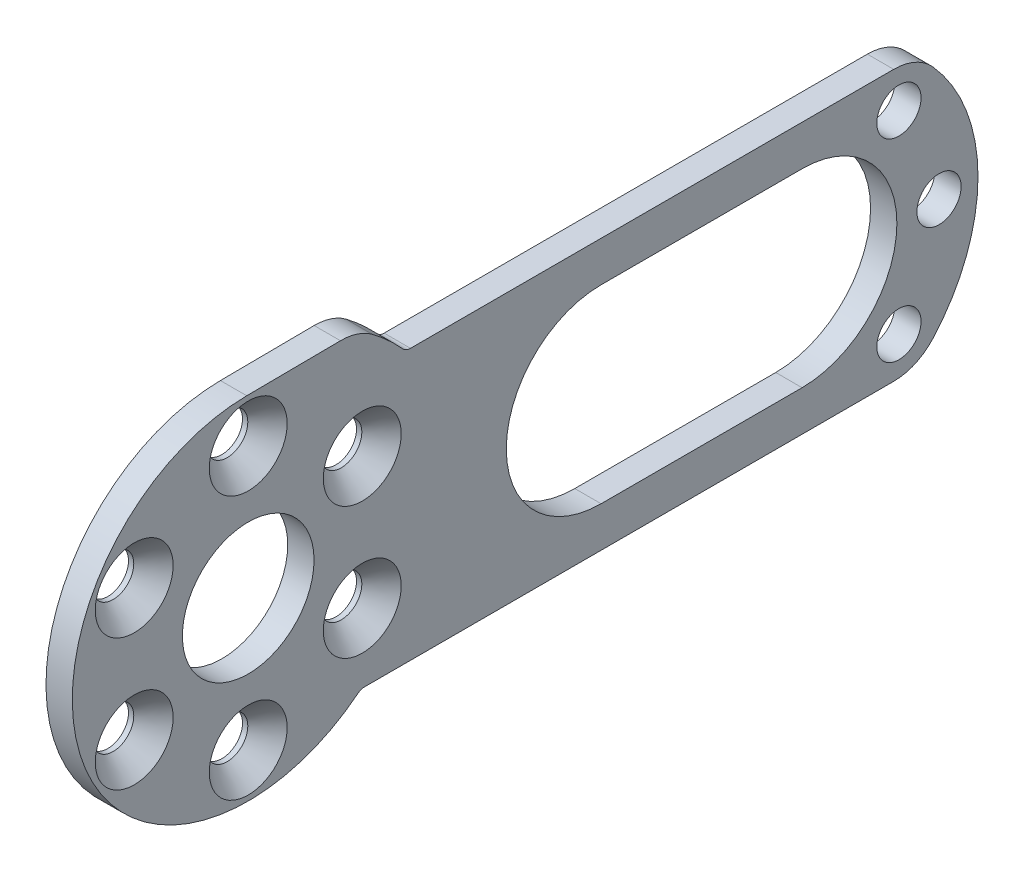
ISO-10303-21;
HEADER;
FILE_DESCRIPTION(('STEP AP214'),'2;1');
FILE_NAME('part.step','',(''),(''),'','','');
FILE_SCHEMA(('AUTOMOTIVE_DESIGN { 1 0 10303 214 1 1 1 1 }'));
ENDSEC;
DATA;
#1=APPLICATION_CONTEXT('core data for automotive mechanical design processes');
#2=APPLICATION_PROTOCOL_DEFINITION('international standard','automotive_design',2000,#1);
#3=PRODUCT_CONTEXT('',#1,'mechanical');
#4=PRODUCT('Part','Part','',(#3));
#5=PRODUCT_RELATED_PRODUCT_CATEGORY('part','',(#4));
#6=PRODUCT_DEFINITION_FORMATION('','',#4);
#7=PRODUCT_DEFINITION_CONTEXT('part definition',#1,'design');
#8=PRODUCT_DEFINITION('design','',#6,#7);
#9=PRODUCT_DEFINITION_SHAPE('','',#8);
#10=(LENGTH_UNIT() NAMED_UNIT(*) SI_UNIT(.MILLI.,.METRE.));
#11=(NAMED_UNIT(*) PLANE_ANGLE_UNIT() SI_UNIT($,.RADIAN.));
#12=(NAMED_UNIT(*) SI_UNIT($,.STERADIAN.) SOLID_ANGLE_UNIT());
#13=UNCERTAINTY_MEASURE_WITH_UNIT(LENGTH_MEASURE(1.E-05),#10,'distance_accuracy_value','');
#14=(GEOMETRIC_REPRESENTATION_CONTEXT(3) GLOBAL_UNCERTAINTY_ASSIGNED_CONTEXT((#13)) GLOBAL_UNIT_ASSIGNED_CONTEXT((#10,
#11,#12)) REPRESENTATION_CONTEXT('',''));
#15=CARTESIAN_POINT('',(0.,0.,0.));
#16=DIRECTION('',(0.,0.,1.));
#17=DIRECTION('',(1.,0.,0.));
#18=AXIS2_PLACEMENT_3D('',#15,#16,#17);
#19=CARTESIAN_POINT('',(-2.74319999999998,0.,0.));
#20=DIRECTION('',(1.,0.,0.));
#21=DIRECTION('',(0.,0.,-1.));
#22=AXIS2_PLACEMENT_3D('',#19,#20,#21);
#23=PLANE('',#22);
#24=CARTESIAN_POINT('',(-2.74319999999998,0.,0.));
#25=DIRECTION('',(1.,0.,0.));
#26=DIRECTION('',(0.,0.,-1.));
#27=AXIS2_PLACEMENT_3D('',#24,#25,#26);
#28=CIRCLE('',#27,7.9375);
#29=CARTESIAN_POINT('',(-2.74319999999998,0.,-7.9375));
#30=VERTEX_POINT('',#29);
#31=EDGE_CURVE('E240',#30,#30,#28,.T.);
#32=ORIENTED_EDGE('',*,*,#31,.T.);
#33=EDGE_LOOP('',(#32));
#34=FACE_BOUND('',#33,.T.);
#35=DIRECTION('',(0.,0.,-1.));
#36=VECTOR('',#35,1.);
#37=CARTESIAN_POINT('',(-2.74319999999998,-11.43,-42.545));
#38=LINE('',#37,#36);
#39=CARTESIAN_POINT('',(-2.74319999999998,-11.43,-42.545));
#40=VERTEX_POINT('',#39);
#41=CARTESIAN_POINT('',(-2.74319999999998,-11.43,-66.77914));
#42=VERTEX_POINT('',#41);
#43=EDGE_CURVE('E218',#40,#42,#38,.T.);
#44=ORIENTED_EDGE('',*,*,#43,.T.);
#45=CARTESIAN_POINT('',(-2.74319999999998,0.,-66.77914));
#46=DIRECTION('',(1.,0.,0.));
#47=DIRECTION('',(0.,0.,-1.));
#48=AXIS2_PLACEMENT_3D('',#45,#46,#47);
#49=CIRCLE('',#48,11.43);
#50=CARTESIAN_POINT('',(-2.74319999999998,11.43,-66.77914));
#51=VERTEX_POINT('',#50);
#52=EDGE_CURVE('E208',#42,#51,#49,.T.);
#53=ORIENTED_EDGE('',*,*,#52,.T.);
#54=DIRECTION('',(0.,0.,1.));
#55=VECTOR('',#54,1.);
#56=CARTESIAN_POINT('',(-2.74319999999998,11.43,-66.77914));
#57=LINE('',#56,#55);
#58=CARTESIAN_POINT('',(-2.74319999999998,11.43,-42.545));
#59=VERTEX_POINT('',#58);
#60=EDGE_CURVE('E211',#51,#59,#57,.T.);
#61=ORIENTED_EDGE('',*,*,#60,.T.);
#62=CARTESIAN_POINT('',(-2.74319999999998,0.,-42.545));
#63=DIRECTION('',(1.,0.,0.));
#64=DIRECTION('',(0.,0.,-1.));
#65=AXIS2_PLACEMENT_3D('',#62,#63,#64);
#66=CIRCLE('',#65,11.43);
#67=EDGE_CURVE('E215',#59,#40,#66,.T.);
#68=ORIENTED_EDGE('',*,*,#67,.T.);
#69=EDGE_LOOP('',(#44,#53,#61,#68));
#70=FACE_BOUND('',#69,.T.);
#71=CARTESIAN_POINT('',(-2.74319999999998,7.93750000000016,13.7481532850779));
#72=DIRECTION('',(1.,0.,0.));
#73=DIRECTION('',(0.,0.,-1.));
#74=AXIS2_PLACEMENT_3D('',#71,#72,#73);
#75=CIRCLE('',#74,2.4892);
#76=CARTESIAN_POINT('',(-2.74319999999998,7.93750000000016,11.2589532850779));
#77=VERTEX_POINT('',#76);
#78=EDGE_CURVE('E204',#77,#77,#75,.T.);
#79=ORIENTED_EDGE('',*,*,#78,.T.);
#80=EDGE_LOOP('',(#79));
#81=FACE_BOUND('',#80,.T.);
#82=CARTESIAN_POINT('',(-2.74319999999998,-7.93749999999987,13.748153285078));
#83=DIRECTION('',(1.,0.,0.));
#84=DIRECTION('',(0.,0.,-1.));
#85=AXIS2_PLACEMENT_3D('',#82,#83,#84);
#86=CIRCLE('',#85,2.4892);
#87=CARTESIAN_POINT('',(-2.74319999999998,-7.93749999999987,11.258953285078));
#88=VERTEX_POINT('',#87);
#89=EDGE_CURVE('E201',#88,#88,#86,.T.);
#90=ORIENTED_EDGE('',*,*,#89,.T.);
#91=EDGE_LOOP('',(#90));
#92=FACE_BOUND('',#91,.T.);
#93=CARTESIAN_POINT('',(-2.74319999999998,-15.875,0.));
#94=DIRECTION('',(1.,0.,0.));
#95=DIRECTION('',(0.,0.,-1.));
#96=AXIS2_PLACEMENT_3D('',#93,#94,#95);
#97=CIRCLE('',#96,2.4892);
#98=CARTESIAN_POINT('',(-2.74319999999998,-15.875,-2.4892));
#99=VERTEX_POINT('',#98);
#100=EDGE_CURVE('E198',#99,#99,#97,.T.);
#101=ORIENTED_EDGE('',*,*,#100,.T.);
#102=EDGE_LOOP('',(#101));
#103=FACE_BOUND('',#102,.T.);
#104=CARTESIAN_POINT('',(-2.74319999999998,-7.93750000000007,-13.7481532850779));
#105=DIRECTION('',(1.,0.,0.));
#106=DIRECTION('',(0.,0.,-1.));
#107=AXIS2_PLACEMENT_3D('',#104,#105,#106);
#108=CIRCLE('',#107,2.4892);
#109=CARTESIAN_POINT('',(-2.74319999999998,-7.93750000000007,-16.2373532850779));
#110=VERTEX_POINT('',#109);
#111=EDGE_CURVE('E195',#110,#110,#108,.T.);
#112=ORIENTED_EDGE('',*,*,#111,.T.);
#113=EDGE_LOOP('',(#112));
#114=FACE_BOUND('',#113,.T.);
#115=CARTESIAN_POINT('',(-2.74319999999998,7.93749999999997,-13.748153285078));
#116=DIRECTION('',(1.,0.,0.));
#117=DIRECTION('',(0.,0.,-1.));
#118=AXIS2_PLACEMENT_3D('',#115,#116,#117);
#119=CIRCLE('',#118,2.4892);
#120=CARTESIAN_POINT('',(-2.74319999999998,7.93749999999997,-16.237353285078));
#121=VERTEX_POINT('',#120);
#122=EDGE_CURVE('E191',#121,#121,#119,.T.);
#123=ORIENTED_EDGE('',*,*,#122,.T.);
#124=EDGE_LOOP('',(#123));
#125=FACE_BOUND('',#124,.T.);
#126=CARTESIAN_POINT('',(-2.74319999999998,15.875,0.));
#127=DIRECTION('',(1.,0.,0.));
#128=DIRECTION('',(0.,0.,-1.));
#129=AXIS2_PLACEMENT_3D('',#126,#127,#128);
#130=CIRCLE('',#129,2.4892);
#131=CARTESIAN_POINT('',(-2.74319999999998,15.875,-2.4892));
#132=VERTEX_POINT('',#131);
#133=EDGE_CURVE('E188',#132,#132,#130,.T.);
#134=ORIENTED_EDGE('',*,*,#133,.T.);
#135=EDGE_LOOP('',(#134));
#136=FACE_BOUND('',#135,.T.);
#137=CARTESIAN_POINT('',(-2.74319999999998,11.6743329573899,-78.4534729573899));
#138=DIRECTION('',(-1.,0.,0.));
#139=DIRECTION('',(0.,0.,1.));
#140=AXIS2_PLACEMENT_3D('',#137,#138,#139);
#141=CIRCLE('',#140,2.667);
#142=CARTESIAN_POINT('',(-2.74319999999998,11.6743329573899,-75.7864729573899));
#143=VERTEX_POINT('',#142);
#144=EDGE_CURVE('E159',#143,#143,#141,.T.);
#145=ORIENTED_EDGE('',*,*,#144,.F.);
#146=EDGE_LOOP('',(#145));
#147=FACE_BOUND('',#146,.T.);
#148=CARTESIAN_POINT('',(-2.74319999999998,0.,-83.28914));
#149=DIRECTION('',(-1.,0.,0.));
#150=DIRECTION('',(0.,0.,1.));
#151=AXIS2_PLACEMENT_3D('',#148,#149,#150);
#152=CIRCLE('',#151,2.667);
#153=CARTESIAN_POINT('',(-2.74319999999998,0.,-80.62214));
#154=VERTEX_POINT('',#153);
#155=EDGE_CURVE('E183',#154,#154,#152,.T.);
#156=ORIENTED_EDGE('',*,*,#155,.F.);
#157=EDGE_LOOP('',(#156));
#158=FACE_BOUND('',#157,.T.);
#159=CARTESIAN_POINT('',(-2.74319999999998,-11.6743329573899,-78.4534729573899));
#160=DIRECTION('',(-1.,0.,0.));
#161=DIRECTION('',(0.,0.,1.));
#162=AXIS2_PLACEMENT_3D('',#159,#160,#161);
#163=CIRCLE('',#162,2.66699999999998);
#164=CARTESIAN_POINT('',(-2.74319999999998,-11.6743329573899,-75.7864729573899));
#165=VERTEX_POINT('',#164);
#166=EDGE_CURVE('E179',#165,#165,#163,.T.);
#167=ORIENTED_EDGE('',*,*,#166,.F.);
#168=EDGE_LOOP('',(#167));
#169=FACE_BOUND('',#168,.T.);
#170=DIRECTION('',(0.,0.00843900847276286,-0.999964390933995));
#171=VECTOR('',#170,1.);
#172=CARTESIAN_POINT('',(-2.74319999999998,21.2082447673191,0.178982930698907));
#173=LINE('',#172,#171);
#174=CARTESIAN_POINT('',(-2.74319999999998,21.2082447673191,0.178982930698907));
#175=VERTEX_POINT('',#174);
#176=CARTESIAN_POINT('',(-2.74319999999998,21.3036248588064,-11.1229010997692));
#177=VERTEX_POINT('',#176);
#178=EDGE_CURVE('E150',#175,#177,#173,.T.);
#179=ORIENTED_EDGE('',*,*,#178,.T.);
#180=CARTESIAN_POINT('',(-2.74319999999998,14.9538509763755,-11.1764888035712));
#181=DIRECTION('',(1.,0.,0.));
#182=DIRECTION('',(0.,0.,-1.));
#183=AXIS2_PLACEMENT_3D('',#180,#181,#182);
#184=CIRCLE('',#183,6.35);
#185=CARTESIAN_POINT('',(-2.74319999999998,20.040194845891,-14.978015607507));
#186=VERTEX_POINT('',#185);
#187=EDGE_CURVE('E257',#177,#186,#184,.F.);
#188=ORIENTED_EDGE('',*,*,#187,.T.);
#189=CARTESIAN_POINT('',(-2.74319999999998,0.,0.));
#190=DIRECTION('',(-1.,0.,0.));
#191=DIRECTION('',(0.,0.,1.));
#192=AXIS2_PLACEMENT_3D('',#189,#190,#191);
#193=CIRCLE('',#192,25.019);
#194=CARTESIAN_POINT('',(-2.74319999999998,16.7129324077992,-18.617955079233));
#195=VERTEX_POINT('',#194);
#196=EDGE_CURVE('E166',#186,#195,#193,.T.);
#197=ORIENTED_EDGE('',*,*,#196,.T.);
#198=CARTESIAN_POINT('',(-2.74319999999998,17.5613046112407,-19.563028941123));
#199=DIRECTION('',(1.,0.,0.));
#200=DIRECTION('',(0.,0.,-1.));
#201=AXIS2_PLACEMENT_3D('',#198,#199,#200);
#202=CIRCLE('',#201,1.27);
#203=CARTESIAN_POINT('',(-2.74319999999998,16.2913046112407,-19.563028941123));
#204=VERTEX_POINT('',#203);
#205=EDGE_CURVE('E287',#195,#204,#202,.T.);
#206=ORIENTED_EDGE('',*,*,#205,.T.);
#207=DIRECTION('',(0.,0.,-1.));
#208=VECTOR('',#207,1.);
#209=CARTESIAN_POINT('',(-2.74319999999998,16.2913046112407,-18.9879897583648));
#210=LINE('',#209,#208);
#211=CARTESIAN_POINT('',(-2.74319999999998,16.2913046112407,-77.8227057116044));
#212=VERTEX_POINT('',#211);
#213=EDGE_CURVE('E169',#204,#212,#210,.T.);
#214=ORIENTED_EDGE('',*,*,#213,.T.);
#215=CARTESIAN_POINT('',(-2.74319999999998,9.94130461124073,-77.8227057116044));
#216=DIRECTION('',(1.,0.,0.));
#217=DIRECTION('',(0.,0.,-1.));
#218=AXIS2_PLACEMENT_3D('',#215,#216,#217);
#219=CIRCLE('',#218,6.35);
#220=CARTESIAN_POINT('',(-2.74319999999998,14.1897253852752,-82.542178237931));
#221=VERTEX_POINT('',#220);
#222=EDGE_CURVE('E255',#212,#221,#219,.F.);
#223=ORIENTED_EDGE('',*,*,#222,.T.);
#224=CARTESIAN_POINT('',(-2.74319999999998,0.,-66.77914));
#225=DIRECTION('',(-1.,0.,0.));
#226=DIRECTION('',(0.,0.,1.));
#227=AXIS2_PLACEMENT_3D('',#224,#225,#226);
#228=CIRCLE('',#227,21.209);
#229=CARTESIAN_POINT('',(-2.74319999999998,-14.1897253852752,-82.542178237931));
#230=VERTEX_POINT('',#229);
#231=EDGE_CURVE('E174',#221,#230,#228,.T.);
#232=ORIENTED_EDGE('',*,*,#231,.T.);
#233=CARTESIAN_POINT('',(-2.74319999999998,-9.94130461124075,-77.8227057116044));
#234=DIRECTION('',(1.,0.,0.));
#235=DIRECTION('',(0.,0.,-1.));
#236=AXIS2_PLACEMENT_3D('',#233,#234,#235);
#237=CIRCLE('',#236,6.35);
#238=CARTESIAN_POINT('',(-2.74319999999998,-16.2913046112407,-77.8227057116044));
#239=VERTEX_POINT('',#238);
#240=EDGE_CURVE('E253',#230,#239,#237,.F.);
#241=ORIENTED_EDGE('',*,*,#240,.T.);
#242=DIRECTION('',(0.,0.,1.));
#243=VECTOR('',#242,1.);
#244=CARTESIAN_POINT('',(-2.74319999999998,-16.2913046112407,-80.3590912172823));
#245=LINE('',#244,#243);
#246=CARTESIAN_POINT('',(-2.74319999999998,-16.2913046112407,-14.0323205975068));
#247=VERTEX_POINT('',#246);
#248=EDGE_CURVE('E177',#239,#247,#245,.T.);
#249=ORIENTED_EDGE('',*,*,#248,.T.);
#250=CARTESIAN_POINT('',(-2.74319999999998,-17.5613046112407,-14.0323205975068));
#251=DIRECTION('',(1.,0.,0.));
#252=DIRECTION('',(0.,0.,-1.));
#253=AXIS2_PLACEMENT_3D('',#250,#251,#252);
#254=CIRCLE('',#253,1.27);
#255=CARTESIAN_POINT('',(-2.74319999999998,-16.5691405089108,-13.2395341230714));
#256=VERTEX_POINT('',#255);
#257=EDGE_CURVE('E65',#247,#256,#254,.T.);
#258=ORIENTED_EDGE('',*,*,#257,.T.);
#259=CARTESIAN_POINT('',(-2.74319999999998,0.,0.));
#260=DIRECTION('',(-1.,0.,0.));
#261=DIRECTION('',(0.,0.,1.));
#262=AXIS2_PLACEMENT_3D('',#259,#260,#261);
#263=CIRCLE('',#262,21.209);
#264=EDGE_CURVE('E147',#256,#175,#263,.T.);
#265=ORIENTED_EDGE('',*,*,#264,.T.);
#266=EDGE_LOOP('',(#179,#188,#197,#206,#214,#223,#232,#241,#249,#258,#265));
#267=FACE_BOUND('',#266,.T.);
#268=ADVANCED_FACE('F41',(#34,#70,#81,#92,#103,#114,#125,#136,#147,#158,#169,#267),#23,.F.);
#269=CARTESIAN_POINT('',(0.431800000000019,0.,0.));
#270=DIRECTION('',(1.,0.,0.));
#271=DIRECTION('',(0.,0.,-1.));
#272=AXIS2_PLACEMENT_3D('',#269,#270,#271);
#273=PLANE('',#272);
#274=CARTESIAN_POINT('',(0.431800000000019,15.875,0.));
#275=DIRECTION('',(1.,0.,0.));
#276=DIRECTION('',(0.,0.,-1.));
#277=AXIS2_PLACEMENT_3D('',#274,#275,#276);
#278=CIRCLE('',#277,4.69718831405322);
#279=CARTESIAN_POINT('',(0.431800000000019,15.875,-4.69718831405322));
#280=VERTEX_POINT('',#279);
#281=EDGE_CURVE('E312',#280,#280,#278,.F.);
#282=ORIENTED_EDGE('',*,*,#281,.T.);
#283=EDGE_LOOP('',(#282));
#284=FACE_BOUND('',#283,.T.);
#285=CARTESIAN_POINT('',(0.431800000000019,7.93749999999997,-13.748153285078));
#286=DIRECTION('',(1.,0.,0.));
#287=DIRECTION('',(0.,0.,-1.));
#288=AXIS2_PLACEMENT_3D('',#285,#286,#287);
#289=CIRCLE('',#288,4.69718831405322);
#290=CARTESIAN_POINT('',(0.431800000000019,7.93749999999997,-18.4453415991312));
#291=VERTEX_POINT('',#290);
#292=EDGE_CURVE('E309',#291,#291,#289,.F.);
#293=ORIENTED_EDGE('',*,*,#292,.T.);
#294=EDGE_LOOP('',(#293));
#295=FACE_BOUND('',#294,.T.);
#296=CARTESIAN_POINT('',(0.431800000000019,-7.93750000000007,-13.7481532850779));
#297=DIRECTION('',(1.,0.,0.));
#298=DIRECTION('',(0.,0.,-1.));
#299=AXIS2_PLACEMENT_3D('',#296,#297,#298);
#300=CIRCLE('',#299,4.69718831405322);
#301=CARTESIAN_POINT('',(0.431800000000019,-7.93750000000007,-18.4453415991311));
#302=VERTEX_POINT('',#301);
#303=EDGE_CURVE('E306',#302,#302,#300,.F.);
#304=ORIENTED_EDGE('',*,*,#303,.T.);
#305=EDGE_LOOP('',(#304));
#306=FACE_BOUND('',#305,.T.);
#307=CARTESIAN_POINT('',(0.431800000000019,-15.875,0.));
#308=DIRECTION('',(1.,0.,0.));
#309=DIRECTION('',(0.,0.,-1.));
#310=AXIS2_PLACEMENT_3D('',#307,#308,#309);
#311=CIRCLE('',#310,4.69718831405322);
#312=CARTESIAN_POINT('',(0.431800000000019,-15.875,-4.69718831405322));
#313=VERTEX_POINT('',#312);
#314=EDGE_CURVE('E303',#313,#313,#311,.F.);
#315=ORIENTED_EDGE('',*,*,#314,.T.);
#316=EDGE_LOOP('',(#315));
#317=FACE_BOUND('',#316,.T.);
#318=CARTESIAN_POINT('',(0.431800000000019,-7.93749999999987,13.748153285078));
#319=DIRECTION('',(1.,0.,0.));
#320=DIRECTION('',(0.,0.,-1.));
#321=AXIS2_PLACEMENT_3D('',#318,#319,#320);
#322=CIRCLE('',#321,4.69718831405322);
#323=CARTESIAN_POINT('',(0.431800000000019,-7.93749999999987,9.05096497102482));
#324=VERTEX_POINT('',#323);
#325=EDGE_CURVE('E300',#324,#324,#322,.F.);
#326=ORIENTED_EDGE('',*,*,#325,.T.);
#327=EDGE_LOOP('',(#326));
#328=FACE_BOUND('',#327,.T.);
#329=CARTESIAN_POINT('',(0.431800000000019,7.93750000000016,13.7481532850779));
#330=DIRECTION('',(1.,0.,0.));
#331=DIRECTION('',(0.,0.,-1.));
#332=AXIS2_PLACEMENT_3D('',#329,#330,#331);
#333=CIRCLE('',#332,4.69718831405322);
#334=CARTESIAN_POINT('',(0.431800000000019,7.93750000000016,9.05096497102465));
#335=VERTEX_POINT('',#334);
#336=EDGE_CURVE('E297',#335,#335,#333,.F.);
#337=ORIENTED_EDGE('',*,*,#336,.T.);
#338=EDGE_LOOP('',(#337));
#339=FACE_BOUND('',#338,.T.);
#340=CARTESIAN_POINT('',(0.431800000000019,0.,0.));
#341=DIRECTION('',(1.,0.,0.));
#342=DIRECTION('',(0.,0.,-1.));
#343=AXIS2_PLACEMENT_3D('',#340,#341,#342);
#344=CIRCLE('',#343,7.9375);
#345=CARTESIAN_POINT('',(0.431800000000019,0.,-7.9375));
#346=VERTEX_POINT('',#345);
#347=EDGE_CURVE('E233',#346,#346,#344,.T.);
#348=ORIENTED_EDGE('',*,*,#347,.F.);
#349=EDGE_LOOP('',(#348));
#350=FACE_BOUND('',#349,.T.);
#351=CARTESIAN_POINT('',(0.431800000000019,0.,-66.77914));
#352=DIRECTION('',(1.,0.,0.));
#353=DIRECTION('',(0.,0.,-1.));
#354=AXIS2_PLACEMENT_3D('',#351,#352,#353);
#355=CIRCLE('',#354,11.43);
#356=CARTESIAN_POINT('',(0.431800000000019,-11.43,-66.77914));
#357=VERTEX_POINT('',#356);
#358=CARTESIAN_POINT('',(0.431800000000019,11.43,-66.77914));
#359=VERTEX_POINT('',#358);
#360=EDGE_CURVE('E207',#357,#359,#355,.T.);
#361=ORIENTED_EDGE('',*,*,#360,.F.);
#362=DIRECTION('',(0.,0.,-1.));
#363=VECTOR('',#362,1.);
#364=CARTESIAN_POINT('',(0.431800000000019,-11.43,-42.545));
#365=LINE('',#364,#363);
#366=CARTESIAN_POINT('',(0.431800000000019,-11.43,-42.545));
#367=VERTEX_POINT('',#366);
#368=EDGE_CURVE('E212',#367,#357,#365,.T.);
#369=ORIENTED_EDGE('',*,*,#368,.F.);
#370=CARTESIAN_POINT('',(0.431800000000019,0.,-42.545));
#371=DIRECTION('',(1.,0.,0.));
#372=DIRECTION('',(0.,0.,-1.));
#373=AXIS2_PLACEMENT_3D('',#370,#371,#372);
#374=CIRCLE('',#373,11.43);
#375=CARTESIAN_POINT('',(0.431800000000019,11.43,-42.545));
#376=VERTEX_POINT('',#375);
#377=EDGE_CURVE('E226',#376,#367,#374,.T.);
#378=ORIENTED_EDGE('',*,*,#377,.F.);
#379=DIRECTION('',(0.,0.,1.));
#380=VECTOR('',#379,1.);
#381=CARTESIAN_POINT('',(0.431800000000019,11.43,-66.77914));
#382=LINE('',#381,#380);
#383=EDGE_CURVE('E223',#359,#376,#382,.T.);
#384=ORIENTED_EDGE('',*,*,#383,.F.);
#385=EDGE_LOOP('',(#361,#369,#378,#384));
#386=FACE_BOUND('',#385,.T.);
#387=CARTESIAN_POINT('',(0.431800000000017,11.6743329573899,-78.4534729573899));
#388=DIRECTION('',(1.,0.,0.));
#389=DIRECTION('',(0.,0.,-1.));
#390=AXIS2_PLACEMENT_3D('',#387,#388,#389);
#391=CIRCLE('',#390,2.667);
#392=CARTESIAN_POINT('',(0.431800000000017,11.6743329573899,-81.1204729573899));
#393=VERTEX_POINT('',#392);
#394=EDGE_CURVE('E182',#393,#393,#391,.T.);
#395=ORIENTED_EDGE('',*,*,#394,.F.);
#396=EDGE_LOOP('',(#395));
#397=FACE_BOUND('',#396,.T.);
#398=CARTESIAN_POINT('',(0.431800000000017,0.,-83.28914));
#399=DIRECTION('',(1.,0.,0.));
#400=DIRECTION('',(0.,0.,-1.));
#401=AXIS2_PLACEMENT_3D('',#398,#399,#400);
#402=CIRCLE('',#401,2.667);
#403=CARTESIAN_POINT('',(0.431800000000017,0.,-85.95614));
#404=VERTEX_POINT('',#403);
#405=EDGE_CURVE('E247',#404,#404,#402,.T.);
#406=ORIENTED_EDGE('',*,*,#405,.F.);
#407=EDGE_LOOP('',(#406));
#408=FACE_BOUND('',#407,.T.);
#409=CARTESIAN_POINT('',(0.431800000000017,-11.6743329573899,-78.4534729573899));
#410=DIRECTION('',(1.,0.,0.));
#411=DIRECTION('',(0.,0.,-1.));
#412=AXIS2_PLACEMENT_3D('',#409,#410,#411);
#413=CIRCLE('',#412,2.66699999999998);
#414=CARTESIAN_POINT('',(0.431800000000017,-11.6743329573899,-81.1204729573899));
#415=VERTEX_POINT('',#414);
#416=EDGE_CURVE('E192',#415,#415,#413,.T.);
#417=ORIENTED_EDGE('',*,*,#416,.F.);
#418=EDGE_LOOP('',(#417));
#419=FACE_BOUND('',#418,.T.);
#420=CARTESIAN_POINT('',(0.431800000000019,0.,0.));
#421=DIRECTION('',(-1.,0.,0.));
#422=DIRECTION('',(0.,0.,1.));
#423=AXIS2_PLACEMENT_3D('',#420,#421,#422);
#424=CIRCLE('',#423,25.019);
#425=CARTESIAN_POINT('',(0.431800000000019,20.040194845891,-14.978015607507));
#426=VERTEX_POINT('',#425);
#427=CARTESIAN_POINT('',(0.431800000000019,16.7129324077992,-18.617955079233));
#428=VERTEX_POINT('',#427);
#429=EDGE_CURVE('E507',#426,#428,#424,.T.);
#430=ORIENTED_EDGE('',*,*,#429,.F.);
#431=CARTESIAN_POINT('',(0.431800000000019,14.9538509763755,-11.1764888035712));
#432=DIRECTION('',(1.,0.,0.));
#433=DIRECTION('',(0.,0.,-1.));
#434=AXIS2_PLACEMENT_3D('',#431,#432,#433);
#435=CIRCLE('',#434,6.35);
#436=CARTESIAN_POINT('',(0.431800000000019,21.3036248588064,-11.1229010997692));
#437=VERTEX_POINT('',#436);
#438=EDGE_CURVE('E266',#426,#437,#435,.T.);
#439=ORIENTED_EDGE('',*,*,#438,.T.);
#440=DIRECTION('',(0.,0.00843900847276286,-0.999964390933995));
#441=VECTOR('',#440,1.);
#442=CARTESIAN_POINT('',(0.431800000000019,21.2082447673191,0.178982930698907));
#443=LINE('',#442,#441);
#444=CARTESIAN_POINT('',(0.431800000000019,21.2082447673191,0.178982930698907));
#445=VERTEX_POINT('',#444);
#446=EDGE_CURVE('E514',#445,#437,#443,.T.);
#447=ORIENTED_EDGE('',*,*,#446,.F.);
#448=CARTESIAN_POINT('',(0.431800000000019,0.,0.));
#449=DIRECTION('',(-1.,0.,0.));
#450=DIRECTION('',(0.,0.,1.));
#451=AXIS2_PLACEMENT_3D('',#448,#449,#450);
#452=CIRCLE('',#451,21.209);
#453=CARTESIAN_POINT('',(0.431800000000019,-16.5691405089108,-13.2395341230714));
#454=VERTEX_POINT('',#453);
#455=EDGE_CURVE('E155',#454,#445,#452,.T.);
#456=ORIENTED_EDGE('',*,*,#455,.F.);
#457=CARTESIAN_POINT('',(0.431800000000019,-17.5613046112407,-14.0323205975068));
#458=DIRECTION('',(1.,0.,0.));
#459=DIRECTION('',(0.,0.,-1.));
#460=AXIS2_PLACEMENT_3D('',#457,#458,#459);
#461=CIRCLE('',#460,1.27);
#462=CARTESIAN_POINT('',(0.431800000000019,-16.2913046112407,-14.0323205975068));
#463=VERTEX_POINT('',#462);
#464=EDGE_CURVE('E292',#454,#463,#461,.F.);
#465=ORIENTED_EDGE('',*,*,#464,.T.);
#466=DIRECTION('',(0.,0.,1.));
#467=VECTOR('',#466,1.);
#468=CARTESIAN_POINT('',(0.431800000000019,-16.2913046112407,-80.3590912172823));
#469=LINE('',#468,#467);
#470=CARTESIAN_POINT('',(0.431800000000019,-16.2913046112407,-77.8227057116044));
#471=VERTEX_POINT('',#470);
#472=EDGE_CURVE('E160',#471,#463,#469,.T.);
#473=ORIENTED_EDGE('',*,*,#472,.F.);
#474=CARTESIAN_POINT('',(0.431800000000019,-9.94130461124075,-77.8227057116044));
#475=DIRECTION('',(1.,0.,0.));
#476=DIRECTION('',(0.,0.,-1.));
#477=AXIS2_PLACEMENT_3D('',#474,#475,#476);
#478=CIRCLE('',#477,6.35);
#479=CARTESIAN_POINT('',(0.431800000000019,-14.1897253852752,-82.542178237931));
#480=VERTEX_POINT('',#479);
#481=EDGE_CURVE('E261',#471,#480,#478,.T.);
#482=ORIENTED_EDGE('',*,*,#481,.T.);
#483=CARTESIAN_POINT('',(0.431800000000019,0.,-66.77914));
#484=DIRECTION('',(-1.,0.,0.));
#485=DIRECTION('',(0.,0.,1.));
#486=AXIS2_PLACEMENT_3D('',#483,#484,#485);
#487=CIRCLE('',#486,21.209);
#488=CARTESIAN_POINT('',(0.431800000000019,14.1897253852752,-82.542178237931));
#489=VERTEX_POINT('',#488);
#490=EDGE_CURVE('E533',#489,#480,#487,.T.);
#491=ORIENTED_EDGE('',*,*,#490,.F.);
#492=CARTESIAN_POINT('',(0.431800000000019,9.94130461124073,-77.8227057116044));
#493=DIRECTION('',(1.,0.,0.));
#494=DIRECTION('',(0.,0.,-1.));
#495=AXIS2_PLACEMENT_3D('',#492,#493,#494);
#496=CIRCLE('',#495,6.35);
#497=CARTESIAN_POINT('',(0.431800000000019,16.2913046112407,-77.8227057116044));
#498=VERTEX_POINT('',#497);
#499=EDGE_CURVE('E263',#489,#498,#496,.T.);
#500=ORIENTED_EDGE('',*,*,#499,.T.);
#501=DIRECTION('',(0.,0.,-1.));
#502=VECTOR('',#501,1.);
#503=CARTESIAN_POINT('',(0.431800000000019,16.2913046112407,-18.9879897583648));
#504=LINE('',#503,#502);
#505=CARTESIAN_POINT('',(0.431800000000019,16.2913046112407,-19.563028941123));
#506=VERTEX_POINT('',#505);
#507=EDGE_CURVE('E513',#506,#498,#504,.T.);
#508=ORIENTED_EDGE('',*,*,#507,.F.);
#509=CARTESIAN_POINT('',(0.431800000000019,17.5613046112407,-19.563028941123));
#510=DIRECTION('',(1.,0.,0.));
#511=DIRECTION('',(0.,0.,-1.));
#512=AXIS2_PLACEMENT_3D('',#509,#510,#511);
#513=CIRCLE('',#512,1.27);
#514=EDGE_CURVE('E289',#506,#428,#513,.F.);
#515=ORIENTED_EDGE('',*,*,#514,.T.);
#516=EDGE_LOOP('',(#430,#439,#447,#456,#465,#473,#482,#491,#500,#508,#515));
#517=FACE_BOUND('',#516,.T.);
#518=ADVANCED_FACE('F344',(#284,#295,#306,#317,#328,#339,#350,#386,#397,#408,#419,#517),#273,.T.);
#519=CARTESIAN_POINT('',(-2.74319999999998,0.,0.));
#520=DIRECTION('',(1.,0.,0.));
#521=DIRECTION('',(0.,0.,-1.));
#522=AXIS2_PLACEMENT_3D('',#519,#520,#521);
#523=CYLINDRICAL_SURFACE('',#522,7.9375);
#524=ORIENTED_EDGE('',*,*,#31,.F.);
#525=EDGE_LOOP('',(#524));
#526=FACE_BOUND('',#525,.T.);
#527=ORIENTED_EDGE('',*,*,#347,.T.);
#528=EDGE_LOOP('',(#527));
#529=FACE_BOUND('',#528,.T.);
#530=ADVANCED_FACE('F350',(#526,#529),#523,.F.);
#531=CARTESIAN_POINT('',(-2.74319999999998,0.,-66.77914));
#532=DIRECTION('',(1.,0.,0.));
#533=DIRECTION('',(0.,0.,-1.));
#534=AXIS2_PLACEMENT_3D('',#531,#532,#533);
#535=CYLINDRICAL_SURFACE('',#534,11.43);
#536=ORIENTED_EDGE('',*,*,#360,.T.);
#537=DIRECTION('',(1.,0.,0.));
#538=VECTOR('',#537,1.);
#539=CARTESIAN_POINT('',(-2.74319999999998,11.43,-66.77914));
#540=LINE('',#539,#538);
#541=EDGE_CURVE('E221',#51,#359,#540,.T.);
#542=ORIENTED_EDGE('',*,*,#541,.F.);
#543=ORIENTED_EDGE('',*,*,#52,.F.);
#544=DIRECTION('',(1.,0.,0.));
#545=VECTOR('',#544,1.);
#546=CARTESIAN_POINT('',(-2.74319999999998,-11.43,-66.77914));
#547=LINE('',#546,#545);
#548=EDGE_CURVE('E231',#42,#357,#547,.T.);
#549=ORIENTED_EDGE('',*,*,#548,.T.);
#550=EDGE_LOOP('',(#536,#542,#543,#549));
#551=FACE_BOUND('',#550,.T.);
#552=ADVANCED_FACE('F468',(#551),#535,.F.);
#553=CARTESIAN_POINT('',(-2.74319999999998,-11.43,-42.545));
#554=DIRECTION('',(0.,-1.,0.));
#555=DIRECTION('',(0.,0.,-1.));
#556=AXIS2_PLACEMENT_3D('',#553,#554,#555);
#557=PLANE('',#556);
#558=ORIENTED_EDGE('',*,*,#368,.T.);
#559=ORIENTED_EDGE('',*,*,#548,.F.);
#560=ORIENTED_EDGE('',*,*,#43,.F.);
#561=DIRECTION('',(1.,0.,0.));
#562=VECTOR('',#561,1.);
#563=CARTESIAN_POINT('',(-2.74319999999998,-11.43,-42.545));
#564=LINE('',#563,#562);
#565=EDGE_CURVE('E234',#40,#367,#564,.T.);
#566=ORIENTED_EDGE('',*,*,#565,.T.);
#567=EDGE_LOOP('',(#558,#559,#560,#566));
#568=FACE_BOUND('',#567,.T.);
#569=ADVANCED_FACE('F464',(#568),#557,.F.);
#570=CARTESIAN_POINT('',(-2.74319999999998,0.,-42.545));
#571=DIRECTION('',(1.,0.,0.));
#572=DIRECTION('',(0.,0.,-1.));
#573=AXIS2_PLACEMENT_3D('',#570,#571,#572);
#574=CYLINDRICAL_SURFACE('',#573,11.43);
#575=ORIENTED_EDGE('',*,*,#377,.T.);
#576=ORIENTED_EDGE('',*,*,#565,.F.);
#577=ORIENTED_EDGE('',*,*,#67,.F.);
#578=DIRECTION('',(1.,0.,0.));
#579=VECTOR('',#578,1.);
#580=CARTESIAN_POINT('',(-2.74319999999998,11.43,-42.545));
#581=LINE('',#580,#579);
#582=EDGE_CURVE('E236',#59,#376,#581,.T.);
#583=ORIENTED_EDGE('',*,*,#582,.T.);
#584=EDGE_LOOP('',(#575,#576,#577,#583));
#585=FACE_BOUND('',#584,.T.);
#586=ADVANCED_FACE('F467',(#585),#574,.F.);
#587=CARTESIAN_POINT('',(-2.74319999999998,11.43,-66.77914));
#588=DIRECTION('',(0.,1.,0.));
#589=DIRECTION('',(0.,0.,1.));
#590=AXIS2_PLACEMENT_3D('',#587,#588,#589);
#591=PLANE('',#590);
#592=ORIENTED_EDGE('',*,*,#383,.T.);
#593=ORIENTED_EDGE('',*,*,#582,.F.);
#594=ORIENTED_EDGE('',*,*,#60,.F.);
#595=ORIENTED_EDGE('',*,*,#541,.T.);
#596=EDGE_LOOP('',(#592,#593,#594,#595));
#597=FACE_BOUND('',#596,.T.);
#598=ADVANCED_FACE('F462',(#597),#591,.F.);
#599=CARTESIAN_POINT('',(-2.74319999999998,7.93750000000016,13.7481532850779));
#600=DIRECTION('',(1.,0.,0.));
#601=DIRECTION('',(0.,0.,-1.));
#602=AXIS2_PLACEMENT_3D('',#599,#600,#601);
#603=CYLINDRICAL_SURFACE('',#602,2.4892);
#604=CARTESIAN_POINT('',(-2.10819999999999,7.93750000000016,13.7481532850779));
#605=DIRECTION('',(1.,0.,0.));
#606=DIRECTION('',(0.,0.,-1.));
#607=AXIS2_PLACEMENT_3D('',#604,#605,#606);
#608=CIRCLE('',#607,2.4892);
#609=CARTESIAN_POINT('',(-2.10819999999999,7.93750000000016,11.2589532850779));
#610=VERTEX_POINT('',#609);
#611=EDGE_CURVE('E11',#610,#610,#608,.T.);
#612=ORIENTED_EDGE('',*,*,#611,.T.);
#613=EDGE_LOOP('',(#612));
#614=FACE_BOUND('',#613,.T.);
#615=ORIENTED_EDGE('',*,*,#78,.F.);
#616=EDGE_LOOP('',(#615));
#617=FACE_BOUND('',#616,.T.);
#618=ADVANCED_FACE('F459',(#614,#617),#603,.F.);
#619=CARTESIAN_POINT('',(-2.74319999999998,-7.93749999999987,13.748153285078));
#620=DIRECTION('',(1.,0.,0.));
#621=DIRECTION('',(0.,0.,-1.));
#622=AXIS2_PLACEMENT_3D('',#619,#620,#621);
#623=CYLINDRICAL_SURFACE('',#622,2.4892);
#624=CARTESIAN_POINT('',(-2.10819999999999,-7.93749999999987,13.748153285078));
#625=DIRECTION('',(1.,0.,0.));
#626=DIRECTION('',(0.,0.,-1.));
#627=AXIS2_PLACEMENT_3D('',#624,#625,#626);
#628=CIRCLE('',#627,2.4892);
#629=CARTESIAN_POINT('',(-2.10819999999999,-7.93749999999987,11.258953285078));
#630=VERTEX_POINT('',#629);
#631=EDGE_CURVE('E50',#630,#630,#628,.T.);
#632=ORIENTED_EDGE('',*,*,#631,.T.);
#633=EDGE_LOOP('',(#632));
#634=FACE_BOUND('',#633,.T.);
#635=ORIENTED_EDGE('',*,*,#89,.F.);
#636=EDGE_LOOP('',(#635));
#637=FACE_BOUND('',#636,.T.);
#638=ADVANCED_FACE('F326',(#634,#637),#623,.F.);
#639=CARTESIAN_POINT('',(-2.74319999999998,-15.875,0.));
#640=DIRECTION('',(1.,0.,0.));
#641=DIRECTION('',(0.,0.,-1.));
#642=AXIS2_PLACEMENT_3D('',#639,#640,#641);
#643=CYLINDRICAL_SURFACE('',#642,2.4892);
#644=CARTESIAN_POINT('',(-2.1082,-15.875,0.));
#645=DIRECTION('',(1.,0.,0.));
#646=DIRECTION('',(0.,0.,-1.));
#647=AXIS2_PLACEMENT_3D('',#644,#645,#646);
#648=CIRCLE('',#647,2.4892);
#649=CARTESIAN_POINT('',(-2.1082,-15.875,-2.4892));
#650=VERTEX_POINT('',#649);
#651=EDGE_CURVE('E321',#650,#650,#648,.T.);
#652=ORIENTED_EDGE('',*,*,#651,.T.);
#653=EDGE_LOOP('',(#652));
#654=FACE_BOUND('',#653,.T.);
#655=ORIENTED_EDGE('',*,*,#100,.F.);
#656=EDGE_LOOP('',(#655));
#657=FACE_BOUND('',#656,.T.);
#658=ADVANCED_FACE('F413',(#654,#657),#643,.F.);
#659=CARTESIAN_POINT('',(-2.74319999999998,-7.93750000000007,-13.7481532850779));
#660=DIRECTION('',(1.,0.,0.));
#661=DIRECTION('',(0.,0.,-1.));
#662=AXIS2_PLACEMENT_3D('',#659,#660,#661);
#663=CYLINDRICAL_SURFACE('',#662,2.4892);
#664=CARTESIAN_POINT('',(-2.1082,-7.93750000000007,-13.7481532850779));
#665=DIRECTION('',(1.,0.,0.));
#666=DIRECTION('',(0.,0.,-1.));
#667=AXIS2_PLACEMENT_3D('',#664,#665,#666);
#668=CIRCLE('',#667,2.4892);
#669=CARTESIAN_POINT('',(-2.1082,-7.93750000000007,-16.2373532850779));
#670=VERTEX_POINT('',#669);
#671=EDGE_CURVE('E318',#670,#670,#668,.T.);
#672=ORIENTED_EDGE('',*,*,#671,.T.);
#673=EDGE_LOOP('',(#672));
#674=FACE_BOUND('',#673,.T.);
#675=ORIENTED_EDGE('',*,*,#111,.F.);
#676=EDGE_LOOP('',(#675));
#677=FACE_BOUND('',#676,.T.);
#678=ADVANCED_FACE('F409',(#674,#677),#663,.F.);
#679=CARTESIAN_POINT('',(-2.74319999999998,7.93749999999997,-13.748153285078));
#680=DIRECTION('',(1.,0.,0.));
#681=DIRECTION('',(0.,0.,-1.));
#682=AXIS2_PLACEMENT_3D('',#679,#680,#681);
#683=CYLINDRICAL_SURFACE('',#682,2.4892);
#684=CARTESIAN_POINT('',(-2.1082,7.93749999999997,-13.748153285078));
#685=DIRECTION('',(1.,0.,0.));
#686=DIRECTION('',(0.,0.,-1.));
#687=AXIS2_PLACEMENT_3D('',#684,#685,#686);
#688=CIRCLE('',#687,2.4892);
#689=CARTESIAN_POINT('',(-2.1082,7.93749999999997,-16.237353285078));
#690=VERTEX_POINT('',#689);
#691=EDGE_CURVE('E315',#690,#690,#688,.T.);
#692=ORIENTED_EDGE('',*,*,#691,.T.);
#693=EDGE_LOOP('',(#692));
#694=FACE_BOUND('',#693,.T.);
#695=ORIENTED_EDGE('',*,*,#122,.F.);
#696=EDGE_LOOP('',(#695));
#697=FACE_BOUND('',#696,.T.);
#698=ADVANCED_FACE('F412',(#694,#697),#683,.F.);
#699=CARTESIAN_POINT('',(-2.74319999999998,15.875,0.));
#700=DIRECTION('',(1.,0.,0.));
#701=DIRECTION('',(0.,0.,-1.));
#702=AXIS2_PLACEMENT_3D('',#699,#700,#701);
#703=CYLINDRICAL_SURFACE('',#702,2.4892);
#704=CARTESIAN_POINT('',(-2.1082,15.875,0.));
#705=DIRECTION('',(1.,0.,0.));
#706=DIRECTION('',(0.,0.,-1.));
#707=AXIS2_PLACEMENT_3D('',#704,#705,#706);
#708=CIRCLE('',#707,2.4892);
#709=CARTESIAN_POINT('',(-2.1082,15.875,-2.4892));
#710=VERTEX_POINT('',#709);
#711=EDGE_CURVE('E294',#710,#710,#708,.T.);
#712=ORIENTED_EDGE('',*,*,#711,.T.);
#713=EDGE_LOOP('',(#712));
#714=FACE_BOUND('',#713,.T.);
#715=ORIENTED_EDGE('',*,*,#133,.F.);
#716=EDGE_LOOP('',(#715));
#717=FACE_BOUND('',#716,.T.);
#718=ADVANCED_FACE('F446',(#714,#717),#703,.F.);
#719=CARTESIAN_POINT('',(41.7068,11.6743329573899,-78.4534729573899));
#720=DIRECTION('',(-1.,0.,0.));
#721=DIRECTION('',(0.,0.,1.));
#722=AXIS2_PLACEMENT_3D('',#719,#720,#721);
#723=CYLINDRICAL_SURFACE('',#722,2.667);
#724=ORIENTED_EDGE('',*,*,#394,.T.);
#725=EDGE_LOOP('',(#724));
#726=FACE_BOUND('',#725,.T.);
#727=ORIENTED_EDGE('',*,*,#144,.T.);
#728=EDGE_LOOP('',(#727));
#729=FACE_BOUND('',#728,.T.);
#730=ADVANCED_FACE('F439',(#726,#729),#723,.F.);
#731=CARTESIAN_POINT('',(41.7068,0.,-83.28914));
#732=DIRECTION('',(-1.,0.,0.));
#733=DIRECTION('',(0.,0.,1.));
#734=AXIS2_PLACEMENT_3D('',#731,#732,#733);
#735=CYLINDRICAL_SURFACE('',#734,2.667);
#736=ORIENTED_EDGE('',*,*,#405,.T.);
#737=EDGE_LOOP('',(#736));
#738=FACE_BOUND('',#737,.T.);
#739=ORIENTED_EDGE('',*,*,#155,.T.);
#740=EDGE_LOOP('',(#739));
#741=FACE_BOUND('',#740,.T.);
#742=ADVANCED_FACE('F430',(#738,#741),#735,.F.);
#743=CARTESIAN_POINT('',(41.7068,-11.6743329573899,-78.4534729573899));
#744=DIRECTION('',(-1.,0.,0.));
#745=DIRECTION('',(0.,0.,1.));
#746=AXIS2_PLACEMENT_3D('',#743,#744,#745);
#747=CYLINDRICAL_SURFACE('',#746,2.66699999999998);
#748=ORIENTED_EDGE('',*,*,#416,.T.);
#749=EDGE_LOOP('',(#748));
#750=FACE_BOUND('',#749,.T.);
#751=ORIENTED_EDGE('',*,*,#166,.T.);
#752=EDGE_LOOP('',(#751));
#753=FACE_BOUND('',#752,.T.);
#754=ADVANCED_FACE('F428',(#750,#753),#747,.F.);
#755=CARTESIAN_POINT('',(0.431800000000019,0.,0.));
#756=DIRECTION('',(-1.,0.,0.));
#757=DIRECTION('',(0.,0.,1.));
#758=AXIS2_PLACEMENT_3D('',#755,#756,#757);
#759=CYLINDRICAL_SURFACE('',#758,21.209);
#760=ORIENTED_EDGE('',*,*,#264,.F.);
#761=DIRECTION('',(-1.,0.,0.));
#762=VECTOR('',#761,1.);
#763=CARTESIAN_POINT('',(0.431800000000019,-16.5691405089108,-13.2395341230714));
#764=LINE('',#763,#762);
#765=EDGE_CURVE('E57',#256,#454,#764,.F.);
#766=ORIENTED_EDGE('',*,*,#765,.T.);
#767=ORIENTED_EDGE('',*,*,#455,.T.);
#768=DIRECTION('',(-1.,0.,0.));
#769=VECTOR('',#768,1.);
#770=CARTESIAN_POINT('',(0.431800000000019,21.2082447673191,0.178982930698907));
#771=LINE('',#770,#769);
#772=EDGE_CURVE('E153',#445,#175,#771,.T.);
#773=ORIENTED_EDGE('',*,*,#772,.T.);
#774=EDGE_LOOP('',(#760,#766,#767,#773));
#775=FACE_BOUND('',#774,.T.);
#776=ADVANCED_FACE('F154',(#775),#759,.T.);
#777=CARTESIAN_POINT('',(0.431800000000019,-16.2913046112407,-80.3590912172823));
#778=DIRECTION('',(0.,-1.,0.));
#779=DIRECTION('',(0.,0.,-1.));
#780=AXIS2_PLACEMENT_3D('',#777,#778,#779);
#781=PLANE('',#780);
#782=ORIENTED_EDGE('',*,*,#472,.T.);
#783=DIRECTION('',(1.,0.,0.));
#784=VECTOR('',#783,1.);
#785=CARTESIAN_POINT('',(-2.74319999999998,-16.2913046112407,-14.0323205975068));
#786=LINE('',#785,#784);
#787=EDGE_CURVE('E283',#463,#247,#786,.F.);
#788=ORIENTED_EDGE('',*,*,#787,.T.);
#789=ORIENTED_EDGE('',*,*,#248,.F.);
#790=DIRECTION('',(-1.,0.,0.));
#791=VECTOR('',#790,1.);
#792=CARTESIAN_POINT('',(0.431800000000019,-16.2913046112407,-77.8227057116044));
#793=LINE('',#792,#791);
#794=EDGE_CURVE('E276',#239,#471,#793,.F.);
#795=ORIENTED_EDGE('',*,*,#794,.T.);
#796=EDGE_LOOP('',(#782,#788,#789,#795));
#797=FACE_BOUND('',#796,.T.);
#798=ADVANCED_FACE('F437',(#797),#781,.T.);
#799=CARTESIAN_POINT('',(0.431800000000019,0.,-66.77914));
#800=DIRECTION('',(-1.,0.,0.));
#801=DIRECTION('',(0.,0.,1.));
#802=AXIS2_PLACEMENT_3D('',#799,#800,#801);
#803=CYLINDRICAL_SURFACE('',#802,21.209);
#804=ORIENTED_EDGE('',*,*,#231,.F.);
#805=DIRECTION('',(-1.,0.,0.));
#806=VECTOR('',#805,1.);
#807=CARTESIAN_POINT('',(0.431800000000019,14.1897253852752,-82.542178237931));
#808=LINE('',#807,#806);
#809=EDGE_CURVE('E274',#221,#489,#808,.F.);
#810=ORIENTED_EDGE('',*,*,#809,.T.);
#811=ORIENTED_EDGE('',*,*,#490,.T.);
#812=DIRECTION('',(-1.,0.,0.));
#813=VECTOR('',#812,1.);
#814=CARTESIAN_POINT('',(0.431800000000019,-14.1897253852752,-82.542178237931));
#815=LINE('',#814,#813);
#816=EDGE_CURVE('E271',#480,#230,#815,.T.);
#817=ORIENTED_EDGE('',*,*,#816,.T.);
#818=EDGE_LOOP('',(#804,#810,#811,#817));
#819=FACE_BOUND('',#818,.T.);
#820=ADVANCED_FACE('F529',(#819),#803,.T.);
#821=CARTESIAN_POINT('',(0.431800000000019,16.2913046112407,-18.9879897583648));
#822=DIRECTION('',(0.,1.,0.));
#823=DIRECTION('',(0.,0.,1.));
#824=AXIS2_PLACEMENT_3D('',#821,#822,#823);
#825=PLANE('',#824);
#826=ORIENTED_EDGE('',*,*,#213,.F.);
#827=DIRECTION('',(1.,0.,0.));
#828=VECTOR('',#827,1.);
#829=CARTESIAN_POINT('',(0.431800000000019,16.2913046112407,-19.563028941123));
#830=LINE('',#829,#828);
#831=EDGE_CURVE('E281',#204,#506,#830,.T.);
#832=ORIENTED_EDGE('',*,*,#831,.T.);
#833=ORIENTED_EDGE('',*,*,#507,.T.);
#834=DIRECTION('',(-1.,0.,0.));
#835=VECTOR('',#834,1.);
#836=CARTESIAN_POINT('',(0.431800000000019,16.2913046112407,-77.8227057116044));
#837=LINE('',#836,#835);
#838=EDGE_CURVE('E268',#498,#212,#837,.T.);
#839=ORIENTED_EDGE('',*,*,#838,.T.);
#840=EDGE_LOOP('',(#826,#832,#833,#839));
#841=FACE_BOUND('',#840,.T.);
#842=ADVANCED_FACE('F523',(#841),#825,.T.);
#843=CARTESIAN_POINT('',(0.431800000000019,0.,0.));
#844=DIRECTION('',(-1.,0.,0.));
#845=DIRECTION('',(0.,0.,1.));
#846=AXIS2_PLACEMENT_3D('',#843,#844,#845);
#847=CYLINDRICAL_SURFACE('',#846,25.019);
#848=ORIENTED_EDGE('',*,*,#429,.T.);
#849=DIRECTION('',(-1.,0.,0.));
#850=VECTOR('',#849,1.);
#851=CARTESIAN_POINT('',(0.431800000000019,16.7129324077992,-18.617955079233));
#852=LINE('',#851,#850);
#853=EDGE_CURVE('E278',#428,#195,#852,.T.);
#854=ORIENTED_EDGE('',*,*,#853,.T.);
#855=ORIENTED_EDGE('',*,*,#196,.F.);
#856=DIRECTION('',(-1.,0.,0.));
#857=VECTOR('',#856,1.);
#858=CARTESIAN_POINT('',(0.431800000000019,20.040194845891,-14.978015607507));
#859=LINE('',#858,#857);
#860=EDGE_CURVE('E259',#186,#426,#859,.F.);
#861=ORIENTED_EDGE('',*,*,#860,.T.);
#862=EDGE_LOOP('',(#848,#854,#855,#861));
#863=FACE_BOUND('',#862,.T.);
#864=ADVANCED_FACE('F518',(#863),#847,.T.);
#865=CARTESIAN_POINT('',(0.431800000000019,21.2082447673191,0.178982930698907));
#866=DIRECTION('',(0.,0.999964390933996,0.00843900847276286));
#867=DIRECTION('',(0.,-0.00843900847276286,0.999964390933995));
#868=AXIS2_PLACEMENT_3D('',#865,#866,#867);
#869=PLANE('',#868);
#870=ORIENTED_EDGE('',*,*,#446,.T.);
#871=DIRECTION('',(-1.,0.,0.));
#872=VECTOR('',#871,1.);
#873=CARTESIAN_POINT('',(0.431800000000019,21.3036248588064,-11.1229010997692));
#874=LINE('',#873,#872);
#875=EDGE_CURVE('E165',#437,#177,#874,.T.);
#876=ORIENTED_EDGE('',*,*,#875,.T.);
#877=ORIENTED_EDGE('',*,*,#178,.F.);
#878=ORIENTED_EDGE('',*,*,#772,.F.);
#879=EDGE_LOOP('',(#870,#876,#877,#878));
#880=FACE_BOUND('',#879,.T.);
#881=ADVANCED_FACE('F163',(#880),#869,.T.);
#882=CARTESIAN_POINT('',(0.431800000000019,14.9538509763755,-11.1764888035712));
#883=DIRECTION('',(-1.,0.,0.));
#884=DIRECTION('',(0.,0.,1.));
#885=AXIS2_PLACEMENT_3D('',#882,#883,#884);
#886=CYLINDRICAL_SURFACE('',#885,6.35);
#887=ORIENTED_EDGE('',*,*,#438,.F.);
#888=ORIENTED_EDGE('',*,*,#860,.F.);
#889=ORIENTED_EDGE('',*,*,#187,.F.);
#890=ORIENTED_EDGE('',*,*,#875,.F.);
#891=EDGE_LOOP('',(#887,#888,#889,#890));
#892=FACE_BOUND('',#891,.T.);
#893=ADVANCED_FACE('F357',(#892),#886,.T.);
#894=CARTESIAN_POINT('',(0.431800000000019,9.94130461124073,-77.8227057116044));
#895=DIRECTION('',(-1.,0.,0.));
#896=DIRECTION('',(0.,0.,1.));
#897=AXIS2_PLACEMENT_3D('',#894,#895,#896);
#898=CYLINDRICAL_SURFACE('',#897,6.35);
#899=ORIENTED_EDGE('',*,*,#499,.F.);
#900=ORIENTED_EDGE('',*,*,#809,.F.);
#901=ORIENTED_EDGE('',*,*,#222,.F.);
#902=ORIENTED_EDGE('',*,*,#838,.F.);
#903=EDGE_LOOP('',(#899,#900,#901,#902));
#904=FACE_BOUND('',#903,.T.);
#905=ADVANCED_FACE('F360',(#904),#898,.T.);
#906=CARTESIAN_POINT('',(0.431800000000019,-9.94130461124075,-77.8227057116044));
#907=DIRECTION('',(-1.,0.,0.));
#908=DIRECTION('',(0.,0.,1.));
#909=AXIS2_PLACEMENT_3D('',#906,#907,#908);
#910=CYLINDRICAL_SURFACE('',#909,6.35);
#911=ORIENTED_EDGE('',*,*,#481,.F.);
#912=ORIENTED_EDGE('',*,*,#794,.F.);
#913=ORIENTED_EDGE('',*,*,#240,.F.);
#914=ORIENTED_EDGE('',*,*,#816,.F.);
#915=EDGE_LOOP('',(#911,#912,#913,#914));
#916=FACE_BOUND('',#915,.T.);
#917=ADVANCED_FACE('F364',(#916),#910,.T.);
#918=CARTESIAN_POINT('',(0.431800000000019,17.5613046112407,-19.563028941123));
#919=DIRECTION('',(-1.,0.,0.));
#920=DIRECTION('',(0.,0.,1.));
#921=AXIS2_PLACEMENT_3D('',#918,#919,#920);
#922=CYLINDRICAL_SURFACE('',#921,1.27);
#923=ORIENTED_EDGE('',*,*,#514,.F.);
#924=ORIENTED_EDGE('',*,*,#831,.F.);
#925=ORIENTED_EDGE('',*,*,#205,.F.);
#926=ORIENTED_EDGE('',*,*,#853,.F.);
#927=EDGE_LOOP('',(#923,#924,#925,#926));
#928=FACE_BOUND('',#927,.T.);
#929=ADVANCED_FACE('F368',(#928),#922,.F.);
#930=CARTESIAN_POINT('',(0.431800000000019,-17.5613046112407,-14.0323205975068));
#931=DIRECTION('',(-1.,0.,0.));
#932=DIRECTION('',(0.,0.,1.));
#933=AXIS2_PLACEMENT_3D('',#930,#931,#932);
#934=CYLINDRICAL_SURFACE('',#933,1.27);
#935=ORIENTED_EDGE('',*,*,#464,.F.);
#936=ORIENTED_EDGE('',*,*,#765,.F.);
#937=ORIENTED_EDGE('',*,*,#257,.F.);
#938=ORIENTED_EDGE('',*,*,#787,.F.);
#939=EDGE_LOOP('',(#935,#936,#937,#938));
#940=FACE_BOUND('',#939,.T.);
#941=ADVANCED_FACE('F372',(#940),#934,.F.);
#942=CARTESIAN_POINT('',(-2.1082,15.875,0.));
#943=DIRECTION('',(1.,0.,0.));
#944=DIRECTION('',(0.,0.,-1.));
#945=AXIS2_PLACEMENT_3D('',#942,#943,#944);
#946=CONICAL_SURFACE('',#945,2.4892,0.715584993317673);
#947=ORIENTED_EDGE('',*,*,#281,.F.);
#948=EDGE_LOOP('',(#947));
#949=FACE_BOUND('',#948,.T.);
#950=ORIENTED_EDGE('',*,*,#711,.F.);
#951=EDGE_LOOP('',(#950));
#952=FACE_BOUND('',#951,.T.);
#953=ADVANCED_FACE('F376',(#949,#952),#946,.F.);
#954=CARTESIAN_POINT('',(-2.1082,7.93749999999997,-13.748153285078));
#955=DIRECTION('',(1.,0.,0.));
#956=DIRECTION('',(0.,0.,-1.));
#957=AXIS2_PLACEMENT_3D('',#954,#955,#956);
#958=CONICAL_SURFACE('',#957,2.4892,0.715584993317673);
#959=ORIENTED_EDGE('',*,*,#292,.F.);
#960=EDGE_LOOP('',(#959));
#961=FACE_BOUND('',#960,.T.);
#962=ORIENTED_EDGE('',*,*,#691,.F.);
#963=EDGE_LOOP('',(#962));
#964=FACE_BOUND('',#963,.T.);
#965=ADVANCED_FACE('F384',(#961,#964),#958,.F.);
#966=CARTESIAN_POINT('',(-2.1082,-7.93750000000007,-13.7481532850779));
#967=DIRECTION('',(1.,0.,0.));
#968=DIRECTION('',(0.,0.,-1.));
#969=AXIS2_PLACEMENT_3D('',#966,#967,#968);
#970=CONICAL_SURFACE('',#969,2.4892,0.715584993317673);
#971=ORIENTED_EDGE('',*,*,#303,.F.);
#972=EDGE_LOOP('',(#971));
#973=FACE_BOUND('',#972,.T.);
#974=ORIENTED_EDGE('',*,*,#671,.F.);
#975=EDGE_LOOP('',(#974));
#976=FACE_BOUND('',#975,.T.);
#977=ADVANCED_FACE('F338',(#973,#976),#970,.F.);
#978=CARTESIAN_POINT('',(-2.1082,-15.875,0.));
#979=DIRECTION('',(1.,0.,0.));
#980=DIRECTION('',(0.,0.,-1.));
#981=AXIS2_PLACEMENT_3D('',#978,#979,#980);
#982=CONICAL_SURFACE('',#981,2.4892,0.715584993317673);
#983=ORIENTED_EDGE('',*,*,#314,.F.);
#984=EDGE_LOOP('',(#983));
#985=FACE_BOUND('',#984,.T.);
#986=ORIENTED_EDGE('',*,*,#651,.F.);
#987=EDGE_LOOP('',(#986));
#988=FACE_BOUND('',#987,.T.);
#989=ADVANCED_FACE('F331',(#985,#988),#982,.F.);
#990=CARTESIAN_POINT('',(-2.10819999999999,-7.93749999999987,13.748153285078));
#991=DIRECTION('',(1.,0.,0.));
#992=DIRECTION('',(0.,0.,-1.));
#993=AXIS2_PLACEMENT_3D('',#990,#991,#992);
#994=CONICAL_SURFACE('',#993,2.4892,0.715584993317673);
#995=ORIENTED_EDGE('',*,*,#325,.F.);
#996=EDGE_LOOP('',(#995));
#997=FACE_BOUND('',#996,.T.);
#998=ORIENTED_EDGE('',*,*,#631,.F.);
#999=EDGE_LOOP('',(#998));
#1000=FACE_BOUND('',#999,.T.);
#1001=ADVANCED_FACE('F329',(#997,#1000),#994,.F.);
#1002=CARTESIAN_POINT('',(-2.10819999999999,7.93750000000016,13.7481532850779));
#1003=DIRECTION('',(1.,0.,0.));
#1004=DIRECTION('',(0.,0.,-1.));
#1005=AXIS2_PLACEMENT_3D('',#1002,#1003,#1004);
#1006=CONICAL_SURFACE('',#1005,2.4892,0.715584993317673);
#1007=ORIENTED_EDGE('',*,*,#336,.F.);
#1008=EDGE_LOOP('',(#1007));
#1009=FACE_BOUND('',#1008,.T.);
#1010=ORIENTED_EDGE('',*,*,#611,.F.);
#1011=EDGE_LOOP('',(#1010));
#1012=FACE_BOUND('',#1011,.T.);
#1013=ADVANCED_FACE('F44',(#1009,#1012),#1006,.F.);
#1014=CLOSED_SHELL('',(#268,#518,#530,#552,#569,#586,#598,#618,#638,#658,#678,#698,#718,#730,
#742,#754,#776,#798,#820,#842,#864,#881,#893,#905,#917,#929,#941,#953,#965,#977,#989,#1001,#1013));
#1015=MANIFOLD_SOLID_BREP('B2',#1014);
#1016=ADVANCED_BREP_SHAPE_REPRESENTATION('',(#18,#1015),#14);
#1017=SHAPE_DEFINITION_REPRESENTATION(#9,#1016);
ENDSEC;
END-ISO-10303-21;
